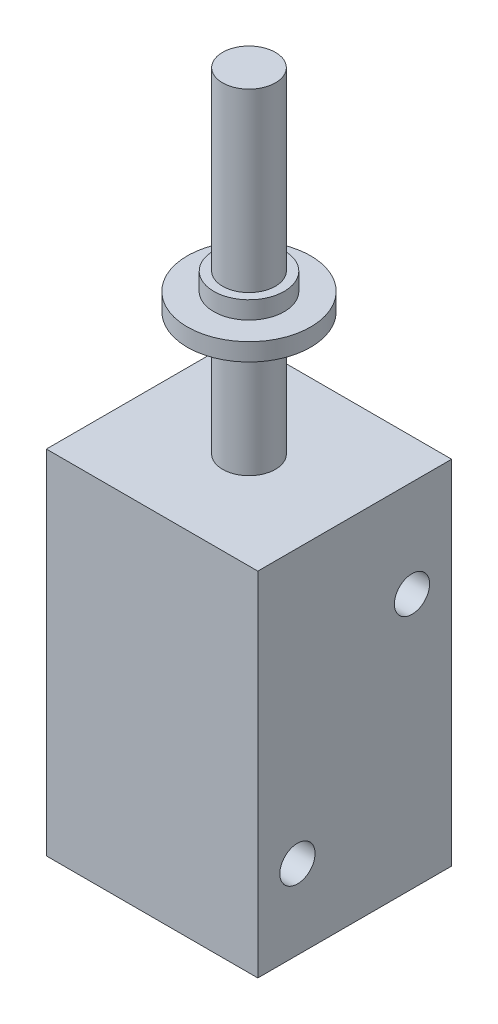
ISO-10303-21;
HEADER;
FILE_DESCRIPTION(('STEP AP214'),'2;1');
FILE_NAME('part.step','',(''),(''),'','','');
FILE_SCHEMA(('AUTOMOTIVE_DESIGN { 1 0 10303 214 1 1 1 1 }'));
ENDSEC;
DATA;
#1=APPLICATION_CONTEXT('core data for automotive mechanical design processes');
#2=APPLICATION_PROTOCOL_DEFINITION('international standard','automotive_design',2000,#1);
#3=PRODUCT_CONTEXT('',#1,'mechanical');
#4=PRODUCT('Part','Part','',(#3));
#5=PRODUCT_RELATED_PRODUCT_CATEGORY('part','',(#4));
#6=PRODUCT_DEFINITION_FORMATION('','',#4);
#7=PRODUCT_DEFINITION_CONTEXT('part definition',#1,'design');
#8=PRODUCT_DEFINITION('design','',#6,#7);
#9=PRODUCT_DEFINITION_SHAPE('','',#8);
#10=(LENGTH_UNIT() NAMED_UNIT(*) SI_UNIT(.MILLI.,.METRE.));
#11=(NAMED_UNIT(*) PLANE_ANGLE_UNIT() SI_UNIT($,.RADIAN.));
#12=(NAMED_UNIT(*) SI_UNIT($,.STERADIAN.) SOLID_ANGLE_UNIT());
#13=UNCERTAINTY_MEASURE_WITH_UNIT(LENGTH_MEASURE(1.E-05),#10,'distance_accuracy_value','');
#14=(GEOMETRIC_REPRESENTATION_CONTEXT(3) GLOBAL_UNCERTAINTY_ASSIGNED_CONTEXT((#13)) GLOBAL_UNIT_ASSIGNED_CONTEXT((#10,
#11,#12)) REPRESENTATION_CONTEXT('',''));
#15=CARTESIAN_POINT('',(0.,0.,0.));
#16=DIRECTION('',(0.,0.,1.));
#17=DIRECTION('',(1.,0.,0.));
#18=AXIS2_PLACEMENT_3D('',#15,#16,#17);
#19=CARTESIAN_POINT('',(6.,39.,-5.5));
#20=DIRECTION('',(0.,-1.,0.));
#21=DIRECTION('',(0.,0.,-1.));
#22=AXIS2_PLACEMENT_3D('',#19,#20,#21);
#23=CYLINDRICAL_SURFACE('',#22,1.5);
#24=CARTESIAN_POINT('',(6.,20.,-5.5));
#25=DIRECTION('',(0.,1.,0.));
#26=DIRECTION('',(0.,0.,1.));
#27=AXIS2_PLACEMENT_3D('',#24,#25,#26);
#28=CIRCLE('',#27,1.5);
#29=CARTESIAN_POINT('',(6.,20.,-4.));
#30=VERTEX_POINT('',#29);
#31=EDGE_CURVE('E46',#30,#30,#28,.T.);
#32=ORIENTED_EDGE('',*,*,#31,.T.);
#33=EDGE_LOOP('',(#32));
#34=FACE_BOUND('',#33,.T.);
#35=CARTESIAN_POINT('',(6.,27.,-5.5));
#36=DIRECTION('',(0.,1.,0.));
#37=DIRECTION('',(0.,0.,1.));
#38=AXIS2_PLACEMENT_3D('',#35,#36,#37);
#39=CIRCLE('',#38,1.5);
#40=CARTESIAN_POINT('',(6.,27.,-4.));
#41=VERTEX_POINT('',#40);
#42=EDGE_CURVE('E11',#41,#41,#39,.T.);
#43=ORIENTED_EDGE('',*,*,#42,.F.);
#44=EDGE_LOOP('',(#43));
#45=FACE_BOUND('',#44,.T.);
#46=ADVANCED_FACE('F36',(#34,#45),#23,.T.);
#47=CARTESIAN_POINT('',(0.,20.,0.));
#48=DIRECTION('',(1.,0.,0.));
#49=DIRECTION('',(0.,0.,-1.));
#50=AXIS2_PLACEMENT_3D('',#47,#48,#49);
#51=PLANE('',#50);
#52=CARTESIAN_POINT('',(0.,4.5,-2.25));
#53=DIRECTION('',(1.,0.,0.));
#54=DIRECTION('',(0.,0.,-1.));
#55=AXIS2_PLACEMENT_3D('',#52,#53,#54);
#56=CIRCLE('',#55,1.);
#57=CARTESIAN_POINT('',(0.,4.5,-3.25));
#58=VERTEX_POINT('',#57);
#59=EDGE_CURVE('E131',#58,#58,#56,.F.);
#60=ORIENTED_EDGE('',*,*,#59,.F.);
#61=EDGE_LOOP('',(#60));
#62=FACE_BOUND('',#61,.T.);
#63=CARTESIAN_POINT('',(0.,14.5,-8.75));
#64=DIRECTION('',(1.,0.,0.));
#65=DIRECTION('',(0.,0.,-1.));
#66=AXIS2_PLACEMENT_3D('',#63,#64,#65);
#67=CIRCLE('',#66,0.999999999999999);
#68=CARTESIAN_POINT('',(0.,14.5,-9.75));
#69=VERTEX_POINT('',#68);
#70=EDGE_CURVE('E138',#69,#69,#67,.F.);
#71=ORIENTED_EDGE('',*,*,#70,.F.);
#72=EDGE_LOOP('',(#71));
#73=FACE_BOUND('',#72,.T.);
#74=DIRECTION('',(0.,0.,1.));
#75=VECTOR('',#74,1.);
#76=CARTESIAN_POINT('',(0.,0.,0.));
#77=LINE('',#76,#75);
#78=CARTESIAN_POINT('',(0.,0.,-11.));
#79=VERTEX_POINT('',#78);
#80=CARTESIAN_POINT('',(0.,0.,0.));
#81=VERTEX_POINT('',#80);
#82=EDGE_CURVE('E105',#79,#81,#77,.T.);
#83=ORIENTED_EDGE('',*,*,#82,.T.);
#84=DIRECTION('',(0.,-1.,0.));
#85=VECTOR('',#84,1.);
#86=CARTESIAN_POINT('',(0.,20.,0.));
#87=LINE('',#86,#85);
#88=CARTESIAN_POINT('',(0.,20.,0.));
#89=VERTEX_POINT('',#88);
#90=EDGE_CURVE('E96',#89,#81,#87,.T.);
#91=ORIENTED_EDGE('',*,*,#90,.F.);
#92=DIRECTION('',(0.,0.,1.));
#93=VECTOR('',#92,1.);
#94=CARTESIAN_POINT('',(0.,20.,0.));
#95=LINE('',#94,#93);
#96=CARTESIAN_POINT('',(0.,20.,-11.));
#97=VERTEX_POINT('',#96);
#98=EDGE_CURVE('E90',#97,#89,#95,.T.);
#99=ORIENTED_EDGE('',*,*,#98,.F.);
#100=DIRECTION('',(0.,-1.,0.));
#101=VECTOR('',#100,1.);
#102=CARTESIAN_POINT('',(0.,20.,-11.));
#103=LINE('',#102,#101);
#104=EDGE_CURVE('E101',#97,#79,#103,.T.);
#105=ORIENTED_EDGE('',*,*,#104,.T.);
#106=EDGE_LOOP('',(#83,#91,#99,#105));
#107=FACE_BOUND('',#106,.T.);
#108=ADVANCED_FACE('F38',(#62,#73,#107),#51,.F.);
#109=CARTESIAN_POINT('',(0.,20.,0.));
#110=DIRECTION('',(0.,0.,-1.));
#111=DIRECTION('',(-1.,0.,0.));
#112=AXIS2_PLACEMENT_3D('',#109,#110,#111);
#113=PLANE('',#112);
#114=DIRECTION('',(1.,0.,0.));
#115=VECTOR('',#114,1.);
#116=CARTESIAN_POINT('',(0.,0.,0.));
#117=LINE('',#116,#115);
#118=CARTESIAN_POINT('',(12.,0.,0.));
#119=VERTEX_POINT('',#118);
#120=EDGE_CURVE('E95',#81,#119,#117,.T.);
#121=ORIENTED_EDGE('',*,*,#120,.T.);
#122=DIRECTION('',(0.,-1.,0.));
#123=VECTOR('',#122,1.);
#124=CARTESIAN_POINT('',(12.,20.,0.));
#125=LINE('',#124,#123);
#126=CARTESIAN_POINT('',(12.,20.,0.));
#127=VERTEX_POINT('',#126);
#128=EDGE_CURVE('E93',#127,#119,#125,.T.);
#129=ORIENTED_EDGE('',*,*,#128,.F.);
#130=DIRECTION('',(1.,0.,0.));
#131=VECTOR('',#130,1.);
#132=CARTESIAN_POINT('',(0.,20.,0.));
#133=LINE('',#132,#131);
#134=EDGE_CURVE('E85',#89,#127,#133,.T.);
#135=ORIENTED_EDGE('',*,*,#134,.F.);
#136=ORIENTED_EDGE('',*,*,#90,.T.);
#137=EDGE_LOOP('',(#121,#129,#135,#136));
#138=FACE_BOUND('',#137,.T.);
#139=ADVANCED_FACE('F94',(#138),#113,.F.);
#140=CARTESIAN_POINT('',(12.,20.,0.));
#141=DIRECTION('',(-1.,0.,0.));
#142=DIRECTION('',(0.,0.,1.));
#143=AXIS2_PLACEMENT_3D('',#140,#141,#142);
#144=PLANE('',#143);
#145=CARTESIAN_POINT('',(12.,4.5,-2.25));
#146=DIRECTION('',(1.,0.,0.));
#147=DIRECTION('',(0.,0.,-1.));
#148=AXIS2_PLACEMENT_3D('',#145,#146,#147);
#149=CIRCLE('',#148,1.);
#150=CARTESIAN_POINT('',(12.,4.5,-3.25));
#151=VERTEX_POINT('',#150);
#152=EDGE_CURVE('E137',#151,#151,#149,.T.);
#153=ORIENTED_EDGE('',*,*,#152,.F.);
#154=EDGE_LOOP('',(#153));
#155=FACE_BOUND('',#154,.T.);
#156=CARTESIAN_POINT('',(12.,14.5,-8.75));
#157=DIRECTION('',(1.,0.,0.));
#158=DIRECTION('',(0.,0.,-1.));
#159=AXIS2_PLACEMENT_3D('',#156,#157,#158);
#160=CIRCLE('',#159,0.999999999999999);
#161=CARTESIAN_POINT('',(12.,14.5,-9.75));
#162=VERTEX_POINT('',#161);
#163=EDGE_CURVE('E134',#162,#162,#160,.T.);
#164=ORIENTED_EDGE('',*,*,#163,.F.);
#165=EDGE_LOOP('',(#164));
#166=FACE_BOUND('',#165,.T.);
#167=DIRECTION('',(0.,0.,-1.));
#168=VECTOR('',#167,1.);
#169=CARTESIAN_POINT('',(12.,0.,0.));
#170=LINE('',#169,#168);
#171=CARTESIAN_POINT('',(12.,0.,-11.));
#172=VERTEX_POINT('',#171);
#173=EDGE_CURVE('E71',#119,#172,#170,.T.);
#174=ORIENTED_EDGE('',*,*,#173,.T.);
#175=DIRECTION('',(0.,-1.,0.));
#176=VECTOR('',#175,1.);
#177=CARTESIAN_POINT('',(12.,20.,-11.));
#178=LINE('',#177,#176);
#179=CARTESIAN_POINT('',(12.,20.,-11.));
#180=VERTEX_POINT('',#179);
#181=EDGE_CURVE('E97',#180,#172,#178,.T.);
#182=ORIENTED_EDGE('',*,*,#181,.F.);
#183=DIRECTION('',(0.,0.,-1.));
#184=VECTOR('',#183,1.);
#185=CARTESIAN_POINT('',(12.,20.,0.));
#186=LINE('',#185,#184);
#187=EDGE_CURVE('E88',#127,#180,#186,.T.);
#188=ORIENTED_EDGE('',*,*,#187,.F.);
#189=ORIENTED_EDGE('',*,*,#128,.T.);
#190=EDGE_LOOP('',(#174,#182,#188,#189));
#191=FACE_BOUND('',#190,.T.);
#192=ADVANCED_FACE('F99',(#155,#166,#191),#144,.F.);
#193=CARTESIAN_POINT('',(0.,20.,-11.));
#194=DIRECTION('',(0.,0.,1.));
#195=DIRECTION('',(1.,0.,0.));
#196=AXIS2_PLACEMENT_3D('',#193,#194,#195);
#197=PLANE('',#196);
#198=DIRECTION('',(-1.,0.,0.));
#199=VECTOR('',#198,1.);
#200=CARTESIAN_POINT('',(0.,0.,-11.));
#201=LINE('',#200,#199);
#202=EDGE_CURVE('E77',#172,#79,#201,.T.);
#203=ORIENTED_EDGE('',*,*,#202,.T.);
#204=ORIENTED_EDGE('',*,*,#104,.F.);
#205=DIRECTION('',(-1.,0.,0.));
#206=VECTOR('',#205,1.);
#207=CARTESIAN_POINT('',(0.,20.,-11.));
#208=LINE('',#207,#206);
#209=EDGE_CURVE('E54',#180,#97,#208,.T.);
#210=ORIENTED_EDGE('',*,*,#209,.F.);
#211=ORIENTED_EDGE('',*,*,#181,.T.);
#212=EDGE_LOOP('',(#203,#204,#210,#211));
#213=FACE_BOUND('',#212,.T.);
#214=ADVANCED_FACE('F150',(#213),#197,.F.);
#215=CARTESIAN_POINT('',(0.,20.,0.));
#216=DIRECTION('',(0.,-1.,0.));
#217=DIRECTION('',(0.,0.,-1.));
#218=AXIS2_PLACEMENT_3D('',#215,#216,#217);
#219=PLANE('',#218);
#220=ORIENTED_EDGE('',*,*,#31,.F.);
#221=EDGE_LOOP('',(#220));
#222=FACE_BOUND('',#221,.T.);
#223=ORIENTED_EDGE('',*,*,#98,.T.);
#224=ORIENTED_EDGE('',*,*,#134,.T.);
#225=ORIENTED_EDGE('',*,*,#187,.T.);
#226=ORIENTED_EDGE('',*,*,#209,.T.);
#227=EDGE_LOOP('',(#223,#224,#225,#226));
#228=FACE_BOUND('',#227,.T.);
#229=ADVANCED_FACE('F86',(#222,#228),#219,.F.);
#230=CARTESIAN_POINT('',(0.,0.,0.));
#231=DIRECTION('',(0.,-1.,0.));
#232=DIRECTION('',(0.,0.,-1.));
#233=AXIS2_PLACEMENT_3D('',#230,#231,#232);
#234=PLANE('',#233);
#235=ORIENTED_EDGE('',*,*,#82,.F.);
#236=ORIENTED_EDGE('',*,*,#202,.F.);
#237=ORIENTED_EDGE('',*,*,#173,.F.);
#238=ORIENTED_EDGE('',*,*,#120,.F.);
#239=EDGE_LOOP('',(#235,#236,#237,#238));
#240=FACE_BOUND('',#239,.T.);
#241=ADVANCED_FACE('F180',(#240),#234,.T.);
#242=CARTESIAN_POINT('',(6.,28.,-5.5));
#243=DIRECTION('',(0.,-1.,0.));
#244=DIRECTION('',(0.,0.,-1.));
#245=AXIS2_PLACEMENT_3D('',#242,#243,#244);
#246=CYLINDRICAL_SURFACE('',#245,3.5);
#247=CARTESIAN_POINT('',(6.,28.,-5.5));
#248=DIRECTION('',(0.,1.,0.));
#249=DIRECTION('',(0.,0.,1.));
#250=AXIS2_PLACEMENT_3D('',#247,#248,#249);
#251=CIRCLE('',#250,3.5);
#252=CARTESIAN_POINT('',(6.,28.,-2.));
#253=VERTEX_POINT('',#252);
#254=EDGE_CURVE('E121',#253,#253,#251,.T.);
#255=ORIENTED_EDGE('',*,*,#254,.F.);
#256=EDGE_LOOP('',(#255));
#257=FACE_BOUND('',#256,.T.);
#258=CARTESIAN_POINT('',(6.,27.,-5.5));
#259=DIRECTION('',(0.,1.,0.));
#260=DIRECTION('',(0.,0.,1.));
#261=AXIS2_PLACEMENT_3D('',#258,#259,#260);
#262=CIRCLE('',#261,3.5);
#263=CARTESIAN_POINT('',(6.,27.,-2.));
#264=VERTEX_POINT('',#263);
#265=EDGE_CURVE('E122',#264,#264,#262,.T.);
#266=ORIENTED_EDGE('',*,*,#265,.T.);
#267=EDGE_LOOP('',(#266));
#268=FACE_BOUND('',#267,.T.);
#269=ADVANCED_FACE('F184',(#257,#268),#246,.T.);
#270=CARTESIAN_POINT('',(6.,28.,-5.5));
#271=DIRECTION('',(0.,1.,0.));
#272=DIRECTION('',(0.,0.,1.));
#273=AXIS2_PLACEMENT_3D('',#270,#271,#272);
#274=PLANE('',#273);
#275=CARTESIAN_POINT('',(6.,28.,-5.5));
#276=DIRECTION('',(0.,1.,0.));
#277=DIRECTION('',(0.,0.,1.));
#278=AXIS2_PLACEMENT_3D('',#275,#276,#277);
#279=CIRCLE('',#278,2.);
#280=CARTESIAN_POINT('',(6.,28.,-3.5));
#281=VERTEX_POINT('',#280);
#282=EDGE_CURVE('E127',#281,#281,#279,.T.);
#283=ORIENTED_EDGE('',*,*,#282,.F.);
#284=EDGE_LOOP('',(#283));
#285=FACE_BOUND('',#284,.T.);
#286=ORIENTED_EDGE('',*,*,#254,.T.);
#287=EDGE_LOOP('',(#286));
#288=FACE_BOUND('',#287,.T.);
#289=ADVANCED_FACE('F215',(#285,#288),#274,.T.);
#290=CARTESIAN_POINT('',(6.,27.,-5.5));
#291=DIRECTION('',(0.,1.,0.));
#292=DIRECTION('',(0.,0.,1.));
#293=AXIS2_PLACEMENT_3D('',#290,#291,#292);
#294=PLANE('',#293);
#295=ORIENTED_EDGE('',*,*,#42,.T.);
#296=EDGE_LOOP('',(#295));
#297=FACE_BOUND('',#296,.T.);
#298=ORIENTED_EDGE('',*,*,#265,.F.);
#299=EDGE_LOOP('',(#298));
#300=FACE_BOUND('',#299,.T.);
#301=ADVANCED_FACE('F223',(#297,#300),#294,.F.);
#302=CARTESIAN_POINT('',(6.,29.,-5.5));
#303=DIRECTION('',(0.,-1.,0.));
#304=DIRECTION('',(0.,0.,-1.));
#305=AXIS2_PLACEMENT_3D('',#302,#303,#304);
#306=CYLINDRICAL_SURFACE('',#305,2.);
#307=CARTESIAN_POINT('',(6.,29.,-5.5));
#308=DIRECTION('',(0.,1.,0.));
#309=DIRECTION('',(0.,0.,1.));
#310=AXIS2_PLACEMENT_3D('',#307,#308,#309);
#311=CIRCLE('',#310,2.);
#312=CARTESIAN_POINT('',(6.,29.,-3.5));
#313=VERTEX_POINT('',#312);
#314=EDGE_CURVE('E130',#313,#313,#311,.T.);
#315=ORIENTED_EDGE('',*,*,#314,.F.);
#316=EDGE_LOOP('',(#315));
#317=FACE_BOUND('',#316,.T.);
#318=ORIENTED_EDGE('',*,*,#282,.T.);
#319=EDGE_LOOP('',(#318));
#320=FACE_BOUND('',#319,.T.);
#321=ADVANCED_FACE('F231',(#317,#320),#306,.T.);
#322=CARTESIAN_POINT('',(6.,29.,-5.5));
#323=DIRECTION('',(0.,1.,0.));
#324=DIRECTION('',(0.,0.,1.));
#325=AXIS2_PLACEMENT_3D('',#322,#323,#324);
#326=PLANE('',#325);
#327=CARTESIAN_POINT('',(6.,29.,-5.5));
#328=DIRECTION('',(0.,1.,0.));
#329=DIRECTION('',(0.,0.,1.));
#330=AXIS2_PLACEMENT_3D('',#327,#328,#329);
#331=CIRCLE('',#330,1.5);
#332=CARTESIAN_POINT('',(6.,29.,-4.));
#333=VERTEX_POINT('',#332);
#334=EDGE_CURVE('E40',#333,#333,#331,.T.);
#335=ORIENTED_EDGE('',*,*,#334,.F.);
#336=EDGE_LOOP('',(#335));
#337=FACE_BOUND('',#336,.T.);
#338=ORIENTED_EDGE('',*,*,#314,.T.);
#339=EDGE_LOOP('',(#338));
#340=FACE_BOUND('',#339,.T.);
#341=ADVANCED_FACE('F238',(#337,#340),#326,.T.);
#342=CARTESIAN_POINT('',(6.,39.,-5.5));
#343=DIRECTION('',(0.,1.,0.));
#344=DIRECTION('',(0.,0.,1.));
#345=AXIS2_PLACEMENT_3D('',#342,#343,#344);
#346=PLANE('',#345);
#347=CARTESIAN_POINT('',(6.,39.,-5.5));
#348=DIRECTION('',(0.,1.,0.));
#349=DIRECTION('',(0.,0.,1.));
#350=AXIS2_PLACEMENT_3D('',#347,#348,#349);
#351=CIRCLE('',#350,1.5);
#352=CARTESIAN_POINT('',(6.,39.,-4.));
#353=VERTEX_POINT('',#352);
#354=EDGE_CURVE('E108',#353,#353,#351,.T.);
#355=ORIENTED_EDGE('',*,*,#354,.T.);
#356=EDGE_LOOP('',(#355));
#357=FACE_BOUND('',#356,.T.);
#358=ADVANCED_FACE('F165',(#357),#346,.T.);
#359=ORIENTED_EDGE('',*,*,#334,.T.);
#360=EDGE_LOOP('',(#359));
#361=FACE_BOUND('',#360,.T.);
#362=ORIENTED_EDGE('',*,*,#354,.F.);
#363=EDGE_LOOP('',(#362));
#364=FACE_BOUND('',#363,.T.);
#365=ADVANCED_FACE('F156',(#361,#364),#23,.T.);
#366=CARTESIAN_POINT('',(-2.82842712474619,14.5,-8.75));
#367=DIRECTION('',(1.,0.,0.));
#368=DIRECTION('',(0.,0.,-1.));
#369=AXIS2_PLACEMENT_3D('',#366,#367,#368);
#370=CYLINDRICAL_SURFACE('',#369,0.999999999999999);
#371=ORIENTED_EDGE('',*,*,#70,.T.);
#372=EDGE_LOOP('',(#371));
#373=FACE_BOUND('',#372,.T.);
#374=ORIENTED_EDGE('',*,*,#163,.T.);
#375=EDGE_LOOP('',(#374));
#376=FACE_BOUND('',#375,.T.);
#377=ADVANCED_FACE('F154',(#373,#376),#370,.F.);
#378=CARTESIAN_POINT('',(-2.82842712474619,4.5,-2.25));
#379=DIRECTION('',(1.,0.,0.));
#380=DIRECTION('',(0.,0.,-1.));
#381=AXIS2_PLACEMENT_3D('',#378,#379,#380);
#382=CYLINDRICAL_SURFACE('',#381,1.);
#383=ORIENTED_EDGE('',*,*,#59,.T.);
#384=EDGE_LOOP('',(#383));
#385=FACE_BOUND('',#384,.T.);
#386=ORIENTED_EDGE('',*,*,#152,.T.);
#387=EDGE_LOOP('',(#386));
#388=FACE_BOUND('',#387,.T.);
#389=ADVANCED_FACE('F146',(#385,#388),#382,.F.);
#390=CLOSED_SHELL('',(#46,#108,#139,#192,#214,#229,#241,#269,#289,#301,#321,#341,#358,#365,#377,#389));
#391=MANIFOLD_SOLID_BREP('B2',#390);
#392=ADVANCED_BREP_SHAPE_REPRESENTATION('',(#18,#391),#14);
#393=SHAPE_DEFINITION_REPRESENTATION(#9,#392);
ENDSEC;
END-ISO-10303-21;
